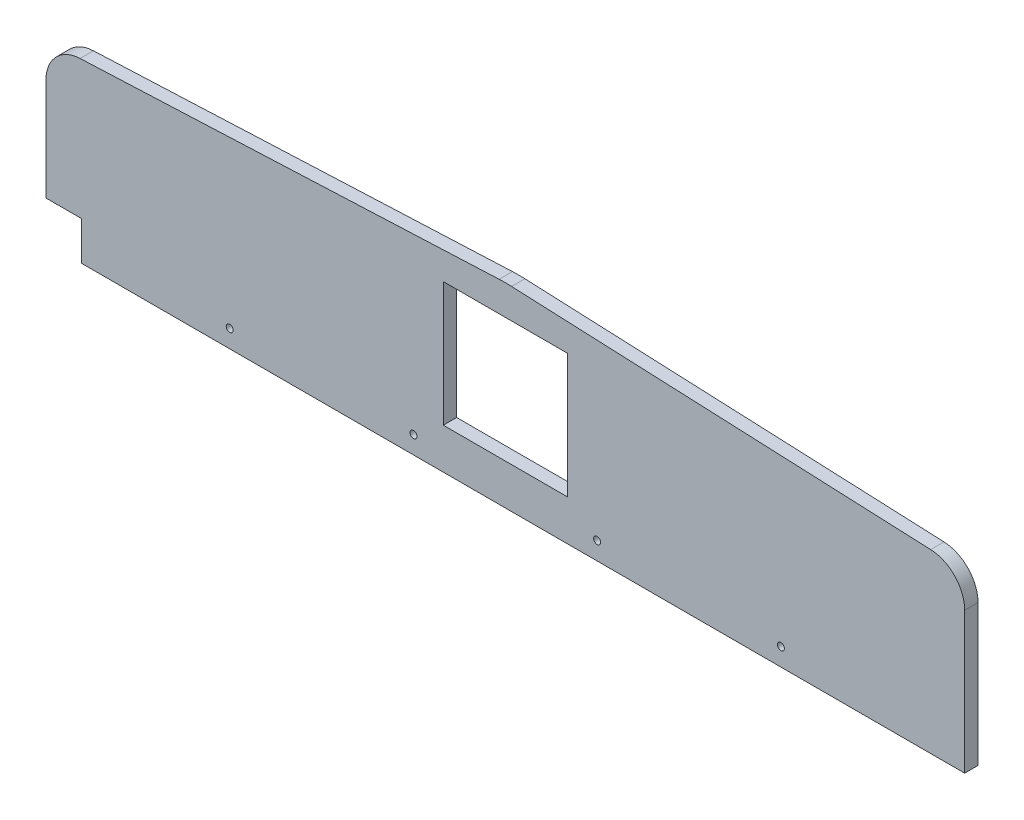
ISO-10303-21;
HEADER;
FILE_DESCRIPTION(('STEP AP214'),'2;1');
FILE_NAME('part.step','',(''),(''),'','','');
FILE_SCHEMA(('AUTOMOTIVE_DESIGN { 1 0 10303 214 1 1 1 1 }'));
ENDSEC;
DATA;
#1=APPLICATION_CONTEXT('core data for automotive mechanical design processes');
#2=APPLICATION_PROTOCOL_DEFINITION('international standard','automotive_design',2000,#1);
#3=PRODUCT_CONTEXT('',#1,'mechanical');
#4=PRODUCT('Part','Part','',(#3));
#5=PRODUCT_RELATED_PRODUCT_CATEGORY('part','',(#4));
#6=PRODUCT_DEFINITION_FORMATION('','',#4);
#7=PRODUCT_DEFINITION_CONTEXT('part definition',#1,'design');
#8=PRODUCT_DEFINITION('design','',#6,#7);
#9=PRODUCT_DEFINITION_SHAPE('','',#8);
#10=(LENGTH_UNIT() NAMED_UNIT(*) SI_UNIT(.MILLI.,.METRE.));
#11=(NAMED_UNIT(*) PLANE_ANGLE_UNIT() SI_UNIT($,.RADIAN.));
#12=(NAMED_UNIT(*) SI_UNIT($,.STERADIAN.) SOLID_ANGLE_UNIT());
#13=UNCERTAINTY_MEASURE_WITH_UNIT(LENGTH_MEASURE(1.E-05),#10,'distance_accuracy_value','');
#14=(GEOMETRIC_REPRESENTATION_CONTEXT(3) GLOBAL_UNCERTAINTY_ASSIGNED_CONTEXT((#13)) GLOBAL_UNIT_ASSIGNED_CONTEXT((#10,
#11,#12)) REPRESENTATION_CONTEXT('',''));
#15=CARTESIAN_POINT('',(0.,0.,0.));
#16=DIRECTION('',(0.,0.,1.));
#17=DIRECTION('',(1.,0.,0.));
#18=AXIS2_PLACEMENT_3D('',#15,#16,#17);
#19=CARTESIAN_POINT('',(328.285794278,29.289499968,4.7625));
#20=DIRECTION('',(0.,1.,0.));
#21=DIRECTION('',(-1.,0.,0.));
#22=AXIS2_PLACEMENT_3D('',#19,#20,#21);
#23=PLANE('',#22);
#24=DIRECTION('',(1.,0.,0.));
#25=VECTOR('',#24,1.);
#26=CARTESIAN_POINT('',(328.285794278,29.289499968,4.7625));
#27=LINE('',#26,#25);
#28=CARTESIAN_POINT('',(-302.931514278,29.289499968,4.7625));
#29=VERTEX_POINT('',#28);
#30=CARTESIAN_POINT('',(328.285794278,29.289499968,4.7625));
#31=VERTEX_POINT('',#30);
#32=EDGE_CURVE('E194',#29,#31,#27,.T.);
#33=ORIENTED_EDGE('',*,*,#32,.F.);
#34=DIRECTION('',(0.,0.,1.));
#35=VECTOR('',#34,1.);
#36=CARTESIAN_POINT('',(-302.931514278,29.289499968,-4.7625));
#37=LINE('',#36,#35);
#38=CARTESIAN_POINT('',(-302.931514278,29.289499968,-4.7625));
#39=VERTEX_POINT('',#38);
#40=EDGE_CURVE('E180',#39,#29,#37,.T.);
#41=ORIENTED_EDGE('',*,*,#40,.F.);
#42=DIRECTION('',(1.,0.,0.));
#43=VECTOR('',#42,1.);
#44=CARTESIAN_POINT('',(328.285794278,29.289499968,-4.7625));
#45=LINE('',#44,#43);
#46=CARTESIAN_POINT('',(328.285794278,29.289499968,-4.7625));
#47=VERTEX_POINT('',#46);
#48=EDGE_CURVE('E187',#39,#47,#45,.T.);
#49=ORIENTED_EDGE('',*,*,#48,.T.);
#50=DIRECTION('',(0.,0.,-1.));
#51=VECTOR('',#50,1.);
#52=CARTESIAN_POINT('',(328.285794278,29.289499968,4.7625));
#53=LINE('',#52,#51);
#54=EDGE_CURVE('E205',#31,#47,#53,.T.);
#55=ORIENTED_EDGE('',*,*,#54,.F.);
#56=EDGE_LOOP('',(#33,#41,#49,#55));
#57=FACE_BOUND('',#56,.T.);
#58=ADVANCED_FACE('F33',(#57),#23,.F.);
#59=CARTESIAN_POINT('',(328.285794278,154.489500012,4.7625));
#60=DIRECTION('',(-1.,0.,0.));
#61=DIRECTION('',(0.,0.,1.));
#62=AXIS2_PLACEMENT_3D('',#59,#60,#61);
#63=PLANE('',#62);
#64=DIRECTION('',(0.,1.,0.));
#65=VECTOR('',#64,1.);
#66=CARTESIAN_POINT('',(328.285794278,154.489500012,-4.7625));
#67=LINE('',#66,#65);
#68=CARTESIAN_POINT('',(328.285794278,130.17604583169,-4.7625));
#69=VERTEX_POINT('',#68);
#70=EDGE_CURVE('E207',#47,#69,#67,.T.);
#71=ORIENTED_EDGE('',*,*,#70,.T.);
#72=DIRECTION('',(0.,0.,-1.));
#73=VECTOR('',#72,1.);
#74=CARTESIAN_POINT('',(328.285794278,130.17604583169,4.7625));
#75=LINE('',#74,#73);
#76=CARTESIAN_POINT('',(328.285794278,130.17604583169,4.7625));
#77=VERTEX_POINT('',#76);
#78=EDGE_CURVE('E237',#69,#77,#75,.F.);
#79=ORIENTED_EDGE('',*,*,#78,.T.);
#80=DIRECTION('',(0.,1.,0.));
#81=VECTOR('',#80,1.);
#82=CARTESIAN_POINT('',(328.285794278,55.6895,4.7625));
#83=LINE('',#82,#81);
#84=EDGE_CURVE('E197',#31,#77,#83,.T.);
#85=ORIENTED_EDGE('',*,*,#84,.F.);
#86=ORIENTED_EDGE('',*,*,#54,.T.);
#87=EDGE_LOOP('',(#71,#79,#85,#86));
#88=FACE_BOUND('',#87,.T.);
#89=ADVANCED_FACE('F286',(#88),#63,.F.);
#90=CARTESIAN_POINT('',(0.,168.8465,4.7625));
#91=DIRECTION('',(-0.0436914735007456,-0.999045071627569,0.));
#92=DIRECTION('',(0.999045071627569,-0.0436914735007456,0.));
#93=AXIS2_PLACEMENT_3D('',#90,#91,#92);
#94=PLANE('',#93);
#95=DIRECTION('',(-0.999045071627569,0.0436914735007456,0.));
#96=VECTOR('',#95,1.);
#97=CARTESIAN_POINT('',(0.,168.8465,-4.7625));
#98=LINE('',#97,#96);
#99=CARTESIAN_POINT('',(303.995557704919,155.551790651031,-4.7625));
#100=VERTEX_POINT('',#99);
#101=CARTESIAN_POINT('',(4.43874463962471,168.65237933487,-4.7625));
#102=VERTEX_POINT('',#101);
#103=EDGE_CURVE('E210',#100,#102,#98,.T.);
#104=ORIENTED_EDGE('',*,*,#103,.T.);
#105=DIRECTION('',(0.,0.,-1.));
#106=VECTOR('',#105,1.);
#107=CARTESIAN_POINT('',(4.43874463962471,168.65237933487,4.7625));
#108=LINE('',#107,#106);
#109=CARTESIAN_POINT('',(4.43874463962471,168.65237933487,4.7625));
#110=VERTEX_POINT('',#109);
#111=EDGE_CURVE('E41',#102,#110,#108,.F.);
#112=ORIENTED_EDGE('',*,*,#111,.T.);
#113=DIRECTION('',(-0.999045071627569,0.0436914735007456,0.));
#114=VECTOR('',#113,1.);
#115=CARTESIAN_POINT('',(0.,168.8465,4.7625));
#116=LINE('',#115,#114);
#117=CARTESIAN_POINT('',(303.995557704919,155.551790651031,4.7625));
#118=VERTEX_POINT('',#117);
#119=EDGE_CURVE('E200',#118,#110,#116,.T.);
#120=ORIENTED_EDGE('',*,*,#119,.F.);
#121=DIRECTION('',(0.,0.,-1.));
#122=VECTOR('',#121,1.);
#123=CARTESIAN_POINT('',(303.995557704919,155.551790651031,4.7625));
#124=LINE('',#123,#122);
#125=EDGE_CURVE('E234',#118,#100,#124,.T.);
#126=ORIENTED_EDGE('',*,*,#125,.T.);
#127=EDGE_LOOP('',(#104,#112,#120,#126));
#128=FACE_BOUND('',#127,.T.);
#129=ADVANCED_FACE('F246',(#128),#94,.F.);
#130=CARTESIAN_POINT('',(-328.331514278,154.489500012,4.7625));
#131=DIRECTION('',(0.0436854010964294,-0.999045337174967,0.));
#132=DIRECTION('',(0.999045337174967,0.0436854010964294,0.));
#133=AXIS2_PLACEMENT_3D('',#130,#131,#132);
#134=PLANE('',#133);
#135=DIRECTION('',(-0.999045337174967,-0.0436854010964294,0.));
#136=VECTOR('',#135,1.);
#137=CARTESIAN_POINT('',(-328.331514278,154.489500012,4.7625));
#138=LINE('',#137,#136);
#139=CARTESIAN_POINT('',(-4.43874581944831,168.652406314486,4.7625));
#140=VERTEX_POINT('',#139);
#141=CARTESIAN_POINT('',(-304.041123465849,155.551649472022,4.7625));
#142=VERTEX_POINT('',#141);
#143=EDGE_CURVE('E203',#140,#142,#138,.T.);
#144=ORIENTED_EDGE('',*,*,#143,.F.);
#145=DIRECTION('',(0.,0.,-1.));
#146=VECTOR('',#145,1.);
#147=CARTESIAN_POINT('',(-4.4387458194482,168.652406314486,4.7625));
#148=LINE('',#147,#146);
#149=CARTESIAN_POINT('',(-4.43874581944831,168.652406314486,-4.7625));
#150=VERTEX_POINT('',#149);
#151=EDGE_CURVE('E239',#140,#150,#148,.T.);
#152=ORIENTED_EDGE('',*,*,#151,.T.);
#153=DIRECTION('',(-0.999045337174967,-0.0436854010964294,0.));
#154=VECTOR('',#153,1.);
#155=CARTESIAN_POINT('',(-328.331514278,154.489500012,-4.7625));
#156=LINE('',#155,#154);
#157=CARTESIAN_POINT('',(-304.041123465849,155.551649472022,-4.7625));
#158=VERTEX_POINT('',#157);
#159=EDGE_CURVE('E213',#150,#158,#156,.T.);
#160=ORIENTED_EDGE('',*,*,#159,.T.);
#161=DIRECTION('',(0.,0.,-1.));
#162=VECTOR('',#161,1.);
#163=CARTESIAN_POINT('',(-304.041123465849,155.551649472022,4.7625));
#164=LINE('',#163,#162);
#165=EDGE_CURVE('E227',#158,#142,#164,.F.);
#166=ORIENTED_EDGE('',*,*,#165,.T.);
#167=EDGE_LOOP('',(#144,#152,#160,#166));
#168=FACE_BOUND('',#167,.T.);
#169=ADVANCED_FACE('F259',(#168),#134,.F.);
#170=CARTESIAN_POINT('',(-328.331514278,55.6895,4.7625));
#171=DIRECTION('',(1.,0.,0.));
#172=DIRECTION('',(0.,0.,-1.));
#173=AXIS2_PLACEMENT_3D('',#170,#171,#172);
#174=PLANE('',#173);
#175=DIRECTION('',(0.,-1.,0.));
#176=VECTOR('',#175,1.);
#177=CARTESIAN_POINT('',(-328.331514278,55.6895,-4.7625));
#178=LINE('',#177,#176);
#179=CARTESIAN_POINT('',(-328.331514278,130.175897907778,-4.7625));
#180=VERTEX_POINT('',#179);
#181=CARTESIAN_POINT('',(-328.331514278,56.975499968,-4.7625));
#182=VERTEX_POINT('',#181);
#183=EDGE_CURVE('E195',#180,#182,#178,.T.);
#184=ORIENTED_EDGE('',*,*,#183,.T.);
#185=DIRECTION('',(0.,0.,1.));
#186=VECTOR('',#185,1.);
#187=CARTESIAN_POINT('',(-328.331514278,56.975499968,-4.7625));
#188=LINE('',#187,#186);
#189=CARTESIAN_POINT('',(-328.331514278,56.975499968,4.7625));
#190=VERTEX_POINT('',#189);
#191=EDGE_CURVE('E184',#182,#190,#188,.T.);
#192=ORIENTED_EDGE('',*,*,#191,.T.);
#193=DIRECTION('',(0.,-1.,0.));
#194=VECTOR('',#193,1.);
#195=CARTESIAN_POINT('',(-328.331514278,29.289499968,4.7625));
#196=LINE('',#195,#194);
#197=CARTESIAN_POINT('',(-328.331514278,130.175897907778,4.7625));
#198=VERTEX_POINT('',#197);
#199=EDGE_CURVE('E191',#198,#190,#196,.T.);
#200=ORIENTED_EDGE('',*,*,#199,.F.);
#201=DIRECTION('',(0.,0.,-1.));
#202=VECTOR('',#201,1.);
#203=CARTESIAN_POINT('',(-328.331514278,130.175897907778,4.7625));
#204=LINE('',#203,#202);
#205=EDGE_CURVE('E219',#198,#180,#204,.T.);
#206=ORIENTED_EDGE('',*,*,#205,.T.);
#207=EDGE_LOOP('',(#184,#192,#200,#206));
#208=FACE_BOUND('',#207,.T.);
#209=ADVANCED_FACE('F268',(#208),#174,.F.);
#210=CARTESIAN_POINT('',(0.,0.,4.7625));
#211=DIRECTION('',(0.,0.,1.));
#212=DIRECTION('',(1.,0.,0.));
#213=AXIS2_PLACEMENT_3D('',#210,#211,#212);
#214=PLANE('',#213);
#215=CARTESIAN_POINT('',(-197.013514278,41.989499968,4.7625));
#216=DIRECTION('',(0.,0.,1.));
#217=DIRECTION('',(1.,0.,0.));
#218=AXIS2_PLACEMENT_3D('',#215,#216,#217);
#219=CIRCLE('',#218,2.5);
#220=CARTESIAN_POINT('',(-194.513514278,41.989499968,4.7625));
#221=VERTEX_POINT('',#220);
#222=EDGE_CURVE('E470',#221,#221,#219,.T.);
#223=ORIENTED_EDGE('',*,*,#222,.F.);
#224=EDGE_LOOP('',(#223));
#225=FACE_BOUND('',#224,.T.);
#226=CARTESIAN_POINT('',(-65.695514278,41.989499968,4.7625));
#227=DIRECTION('',(0.,0.,1.));
#228=DIRECTION('',(1.,0.,0.));
#229=AXIS2_PLACEMENT_3D('',#226,#227,#228);
#230=CIRCLE('',#229,2.49999999999999);
#231=CARTESIAN_POINT('',(-63.195514278,41.989499968,4.7625));
#232=VERTEX_POINT('',#231);
#233=EDGE_CURVE('E472',#232,#232,#230,.T.);
#234=ORIENTED_EDGE('',*,*,#233,.F.);
#235=EDGE_LOOP('',(#234));
#236=FACE_BOUND('',#235,.T.);
#237=CARTESIAN_POINT('',(65.622485722,41.989499968,4.7625));
#238=DIRECTION('',(0.,0.,1.));
#239=DIRECTION('',(1.,0.,0.));
#240=AXIS2_PLACEMENT_3D('',#237,#238,#239);
#241=CIRCLE('',#240,2.49999999999999);
#242=CARTESIAN_POINT('',(68.122485722,41.989499968,4.7625));
#243=VERTEX_POINT('',#242);
#244=EDGE_CURVE('E480',#243,#243,#241,.T.);
#245=ORIENTED_EDGE('',*,*,#244,.F.);
#246=EDGE_LOOP('',(#245));
#247=FACE_BOUND('',#246,.T.);
#248=CARTESIAN_POINT('',(196.940485722,41.989499968,4.7625));
#249=DIRECTION('',(0.,0.,1.));
#250=DIRECTION('',(1.,0.,0.));
#251=AXIS2_PLACEMENT_3D('',#248,#249,#250);
#252=CIRCLE('',#251,2.5);
#253=CARTESIAN_POINT('',(199.440485722,41.989499968,4.7625));
#254=VERTEX_POINT('',#253);
#255=EDGE_CURVE('E485',#254,#254,#252,.T.);
#256=ORIENTED_EDGE('',*,*,#255,.F.);
#257=EDGE_LOOP('',(#256));
#258=FACE_BOUND('',#257,.T.);
#259=DIRECTION('',(0.,1.,0.));
#260=VECTOR('',#259,1.);
#261=CARTESIAN_POINT('',(44.5173495735589,147.268650450239,4.7625));
#262=LINE('',#261,#260);
#263=CARTESIAN_POINT('',(44.5173495735589,58.3686504502388,4.7625));
#264=VERTEX_POINT('',#263);
#265=CARTESIAN_POINT('',(44.5173495735589,147.268650450239,4.7625));
#266=VERTEX_POINT('',#265);
#267=EDGE_CURVE('E48',#264,#266,#262,.T.);
#268=ORIENTED_EDGE('',*,*,#267,.F.);
#269=DIRECTION('',(1.,0.,0.));
#270=VECTOR('',#269,1.);
#271=CARTESIAN_POINT('',(-44.3826504264411,58.3686504502388,4.7625));
#272=LINE('',#271,#270);
#273=CARTESIAN_POINT('',(-44.3826504264411,58.3686504502388,4.7625));
#274=VERTEX_POINT('',#273);
#275=EDGE_CURVE('E151',#274,#264,#272,.T.);
#276=ORIENTED_EDGE('',*,*,#275,.F.);
#277=DIRECTION('',(0.,-1.,0.));
#278=VECTOR('',#277,1.);
#279=CARTESIAN_POINT('',(-44.3826504264411,147.268650450239,4.7625));
#280=LINE('',#279,#278);
#281=CARTESIAN_POINT('',(-44.3826504264411,147.268650450239,4.7625));
#282=VERTEX_POINT('',#281);
#283=EDGE_CURVE('E154',#282,#274,#280,.T.);
#284=ORIENTED_EDGE('',*,*,#283,.F.);
#285=DIRECTION('',(-1.,0.,0.));
#286=VECTOR('',#285,1.);
#287=CARTESIAN_POINT('',(-44.3826504264411,147.268650450239,4.7625));
#288=LINE('',#287,#286);
#289=EDGE_CURVE('E163',#266,#282,#288,.T.);
#290=ORIENTED_EDGE('',*,*,#289,.F.);
#291=EDGE_LOOP('',(#268,#276,#284,#290));
#292=FACE_BOUND('',#291,.T.);
#293=DIRECTION('',(-1.,0.,0.));
#294=VECTOR('',#293,1.);
#295=CARTESIAN_POINT('',(-328.331514278,56.975499968,4.7625));
#296=LINE('',#295,#294);
#297=CARTESIAN_POINT('',(-302.931514278,56.975499968,4.7625));
#298=VERTEX_POINT('',#297);
#299=EDGE_CURVE('E177',#298,#190,#296,.T.);
#300=ORIENTED_EDGE('',*,*,#299,.F.);
#301=DIRECTION('',(0.,1.,0.));
#302=VECTOR('',#301,1.);
#303=CARTESIAN_POINT('',(-302.931514278,29.289499968,4.7625));
#304=LINE('',#303,#302);
#305=EDGE_CURVE('E169',#29,#298,#304,.T.);
#306=ORIENTED_EDGE('',*,*,#305,.F.);
#307=ORIENTED_EDGE('',*,*,#32,.T.);
#308=ORIENTED_EDGE('',*,*,#84,.T.);
#309=CARTESIAN_POINT('',(302.885794278,130.17604583169,4.7625));
#310=DIRECTION('',(0.,0.,1.));
#311=DIRECTION('',(1.,0.,0.));
#312=AXIS2_PLACEMENT_3D('',#309,#310,#311);
#313=CIRCLE('',#312,25.4);
#314=EDGE_CURVE('E230',#77,#118,#313,.T.);
#315=ORIENTED_EDGE('',*,*,#314,.T.);
#316=ORIENTED_EDGE('',*,*,#119,.T.);
#317=CARTESIAN_POINT('',(-0.000309068051040917,67.1494000575094,4.7625));
#318=DIRECTION('',(0.,0.,1.));
#319=DIRECTION('',(1.,0.,0.));
#320=AXIS2_PLACEMENT_3D('',#317,#318,#319);
#321=CIRCLE('',#320,101.6);
#322=EDGE_CURVE('E11',#110,#140,#321,.T.);
#323=ORIENTED_EDGE('',*,*,#322,.T.);
#324=ORIENTED_EDGE('',*,*,#143,.T.);
#325=CARTESIAN_POINT('',(-302.931514278,130.175897907778,4.7625));
#326=DIRECTION('',(0.,0.,1.));
#327=DIRECTION('',(1.,0.,0.));
#328=AXIS2_PLACEMENT_3D('',#325,#326,#327);
#329=CIRCLE('',#328,25.4);
#330=EDGE_CURVE('E232',#142,#198,#329,.T.);
#331=ORIENTED_EDGE('',*,*,#330,.T.);
#332=ORIENTED_EDGE('',*,*,#199,.T.);
#333=EDGE_LOOP('',(#300,#306,#307,#308,#315,#316,#323,#324,#331,#332));
#334=FACE_BOUND('',#333,.T.);
#335=ADVANCED_FACE('F253',(#225,#236,#247,#258,#292,#334),#214,.T.);
#336=CARTESIAN_POINT('',(0.,0.,-4.7625));
#337=DIRECTION('',(0.,0.,1.));
#338=DIRECTION('',(1.,0.,0.));
#339=AXIS2_PLACEMENT_3D('',#336,#337,#338);
#340=PLANE('',#339);
#341=CARTESIAN_POINT('',(-197.013514278,41.989499968,-4.7625));
#342=DIRECTION('',(0.,0.,1.));
#343=DIRECTION('',(1.,0.,0.));
#344=AXIS2_PLACEMENT_3D('',#341,#342,#343);
#345=CIRCLE('',#344,2.5);
#346=CARTESIAN_POINT('',(-194.513514278,41.989499968,-4.7625));
#347=VERTEX_POINT('',#346);
#348=EDGE_CURVE('E467',#347,#347,#345,.T.);
#349=ORIENTED_EDGE('',*,*,#348,.T.);
#350=EDGE_LOOP('',(#349));
#351=FACE_BOUND('',#350,.T.);
#352=CARTESIAN_POINT('',(-65.695514278,41.989499968,-4.7625));
#353=DIRECTION('',(0.,0.,1.));
#354=DIRECTION('',(1.,0.,0.));
#355=AXIS2_PLACEMENT_3D('',#352,#353,#354);
#356=CIRCLE('',#355,2.5);
#357=CARTESIAN_POINT('',(-63.195514278,41.989499968,-4.7625));
#358=VERTEX_POINT('',#357);
#359=EDGE_CURVE('E477',#358,#358,#356,.T.);
#360=ORIENTED_EDGE('',*,*,#359,.T.);
#361=EDGE_LOOP('',(#360));
#362=FACE_BOUND('',#361,.T.);
#363=CARTESIAN_POINT('',(65.622485722,41.989499968,-4.7625));
#364=DIRECTION('',(0.,0.,1.));
#365=DIRECTION('',(1.,0.,0.));
#366=AXIS2_PLACEMENT_3D('',#363,#364,#365);
#367=CIRCLE('',#366,2.5);
#368=CARTESIAN_POINT('',(68.122485722,41.989499968,-4.7625));
#369=VERTEX_POINT('',#368);
#370=EDGE_CURVE('E483',#369,#369,#367,.T.);
#371=ORIENTED_EDGE('',*,*,#370,.T.);
#372=EDGE_LOOP('',(#371));
#373=FACE_BOUND('',#372,.T.);
#374=CARTESIAN_POINT('',(196.940485722,41.989499968,-4.7625));
#375=DIRECTION('',(0.,0.,1.));
#376=DIRECTION('',(1.,0.,0.));
#377=AXIS2_PLACEMENT_3D('',#374,#375,#376);
#378=CIRCLE('',#377,2.5);
#379=CARTESIAN_POINT('',(199.440485722,41.989499968,-4.7625));
#380=VERTEX_POINT('',#379);
#381=EDGE_CURVE('E157',#380,#380,#378,.T.);
#382=ORIENTED_EDGE('',*,*,#381,.T.);
#383=EDGE_LOOP('',(#382));
#384=FACE_BOUND('',#383,.T.);
#385=DIRECTION('',(1.,0.,0.));
#386=VECTOR('',#385,1.);
#387=CARTESIAN_POINT('',(-44.3826504264411,58.3686504502388,-4.7625));
#388=LINE('',#387,#386);
#389=CARTESIAN_POINT('',(-44.3826504264411,58.3686504502388,-4.7625));
#390=VERTEX_POINT('',#389);
#391=CARTESIAN_POINT('',(44.5173495735589,58.3686504502388,-4.7625));
#392=VERTEX_POINT('',#391);
#393=EDGE_CURVE('E141',#390,#392,#388,.T.);
#394=ORIENTED_EDGE('',*,*,#393,.T.);
#395=DIRECTION('',(0.,1.,0.));
#396=VECTOR('',#395,1.);
#397=CARTESIAN_POINT('',(44.5173495735589,147.268650450239,-4.7625));
#398=LINE('',#397,#396);
#399=CARTESIAN_POINT('',(44.5173495735589,147.268650450239,-4.7625));
#400=VERTEX_POINT('',#399);
#401=EDGE_CURVE('E135',#392,#400,#398,.T.);
#402=ORIENTED_EDGE('',*,*,#401,.T.);
#403=DIRECTION('',(-1.,0.,0.));
#404=VECTOR('',#403,1.);
#405=CARTESIAN_POINT('',(-44.3826504264411,147.268650450239,-4.7625));
#406=LINE('',#405,#404);
#407=CARTESIAN_POINT('',(-44.3826504264411,147.268650450239,-4.7625));
#408=VERTEX_POINT('',#407);
#409=EDGE_CURVE('E144',#400,#408,#406,.T.);
#410=ORIENTED_EDGE('',*,*,#409,.T.);
#411=DIRECTION('',(0.,-1.,0.));
#412=VECTOR('',#411,1.);
#413=CARTESIAN_POINT('',(-44.3826504264411,147.268650450239,-4.7625));
#414=LINE('',#413,#412);
#415=EDGE_CURVE('E56',#408,#390,#414,.T.);
#416=ORIENTED_EDGE('',*,*,#415,.T.);
#417=EDGE_LOOP('',(#394,#402,#410,#416));
#418=FACE_BOUND('',#417,.T.);
#419=DIRECTION('',(0.,1.,0.));
#420=VECTOR('',#419,1.);
#421=CARTESIAN_POINT('',(-302.931514278,29.289499968,-4.7625));
#422=LINE('',#421,#420);
#423=CARTESIAN_POINT('',(-302.931514278,56.975499968,-4.7625));
#424=VERTEX_POINT('',#423);
#425=EDGE_CURVE('E173',#39,#424,#422,.T.);
#426=ORIENTED_EDGE('',*,*,#425,.T.);
#427=DIRECTION('',(-1.,0.,0.));
#428=VECTOR('',#427,1.);
#429=CARTESIAN_POINT('',(-328.331514278,56.975499968,-4.7625));
#430=LINE('',#429,#428);
#431=EDGE_CURVE('E176',#424,#182,#430,.T.);
#432=ORIENTED_EDGE('',*,*,#431,.T.);
#433=ORIENTED_EDGE('',*,*,#183,.F.);
#434=CARTESIAN_POINT('',(-302.931514278,130.175897907778,-4.7625));
#435=DIRECTION('',(0.,0.,1.));
#436=DIRECTION('',(1.,0.,0.));
#437=AXIS2_PLACEMENT_3D('',#434,#435,#436);
#438=CIRCLE('',#437,25.4);
#439=EDGE_CURVE('E224',#180,#158,#438,.F.);
#440=ORIENTED_EDGE('',*,*,#439,.T.);
#441=ORIENTED_EDGE('',*,*,#159,.F.);
#442=CARTESIAN_POINT('',(-0.000309068051040917,67.1494000575094,-4.7625));
#443=DIRECTION('',(0.,0.,1.));
#444=DIRECTION('',(1.,0.,0.));
#445=AXIS2_PLACEMENT_3D('',#442,#443,#444);
#446=CIRCLE('',#445,101.6);
#447=EDGE_CURVE('E242',#150,#102,#446,.F.);
#448=ORIENTED_EDGE('',*,*,#447,.T.);
#449=ORIENTED_EDGE('',*,*,#103,.F.);
#450=CARTESIAN_POINT('',(302.885794278,130.17604583169,-4.7625));
#451=DIRECTION('',(0.,0.,1.));
#452=DIRECTION('',(1.,0.,0.));
#453=AXIS2_PLACEMENT_3D('',#450,#451,#452);
#454=CIRCLE('',#453,25.4);
#455=EDGE_CURVE('E222',#100,#69,#454,.F.);
#456=ORIENTED_EDGE('',*,*,#455,.T.);
#457=ORIENTED_EDGE('',*,*,#70,.F.);
#458=ORIENTED_EDGE('',*,*,#48,.F.);
#459=EDGE_LOOP('',(#426,#432,#433,#440,#441,#448,#449,#456,#457,#458));
#460=FACE_BOUND('',#459,.T.);
#461=ADVANCED_FACE('F148',(#351,#362,#373,#384,#418,#460),#340,.F.);
#462=CARTESIAN_POINT('',(-302.931514278,130.175897907778,4.7625));
#463=DIRECTION('',(0.,0.,-1.));
#464=DIRECTION('',(-1.,0.,0.));
#465=AXIS2_PLACEMENT_3D('',#462,#463,#464);
#466=CYLINDRICAL_SURFACE('',#465,25.4);
#467=ORIENTED_EDGE('',*,*,#330,.F.);
#468=ORIENTED_EDGE('',*,*,#165,.F.);
#469=ORIENTED_EDGE('',*,*,#439,.F.);
#470=ORIENTED_EDGE('',*,*,#205,.F.);
#471=EDGE_LOOP('',(#467,#468,#469,#470));
#472=FACE_BOUND('',#471,.T.);
#473=ADVANCED_FACE('F265',(#472),#466,.T.);
#474=CARTESIAN_POINT('',(302.885794278,130.17604583169,4.7625));
#475=DIRECTION('',(0.,0.,-1.));
#476=DIRECTION('',(-1.,0.,0.));
#477=AXIS2_PLACEMENT_3D('',#474,#475,#476);
#478=CYLINDRICAL_SURFACE('',#477,25.4);
#479=ORIENTED_EDGE('',*,*,#314,.F.);
#480=ORIENTED_EDGE('',*,*,#78,.F.);
#481=ORIENTED_EDGE('',*,*,#455,.F.);
#482=ORIENTED_EDGE('',*,*,#125,.F.);
#483=EDGE_LOOP('',(#479,#480,#481,#482));
#484=FACE_BOUND('',#483,.T.);
#485=ADVANCED_FACE('F285',(#484),#478,.T.);
#486=CARTESIAN_POINT('',(-0.000309068051040917,67.1494000575094,4.7625));
#487=DIRECTION('',(0.,0.,-1.));
#488=DIRECTION('',(-1.,0.,0.));
#489=AXIS2_PLACEMENT_3D('',#486,#487,#488);
#490=CYLINDRICAL_SURFACE('',#489,101.6);
#491=ORIENTED_EDGE('',*,*,#322,.F.);
#492=ORIENTED_EDGE('',*,*,#111,.F.);
#493=ORIENTED_EDGE('',*,*,#447,.F.);
#494=ORIENTED_EDGE('',*,*,#151,.F.);
#495=EDGE_LOOP('',(#491,#492,#493,#494));
#496=FACE_BOUND('',#495,.T.);
#497=ADVANCED_FACE('F35',(#496),#490,.T.);
#498=CARTESIAN_POINT('',(-328.331514278,56.975499968,-4.7625));
#499=DIRECTION('',(0.,1.,0.));
#500=DIRECTION('',(0.,0.,1.));
#501=AXIS2_PLACEMENT_3D('',#498,#499,#500);
#502=PLANE('',#501);
#503=ORIENTED_EDGE('',*,*,#299,.T.);
#504=ORIENTED_EDGE('',*,*,#191,.F.);
#505=ORIENTED_EDGE('',*,*,#431,.F.);
#506=DIRECTION('',(0.,0.,1.));
#507=VECTOR('',#506,1.);
#508=CARTESIAN_POINT('',(-302.931514278,56.975499968,-4.7625));
#509=LINE('',#508,#507);
#510=EDGE_CURVE('E188',#424,#298,#509,.T.);
#511=ORIENTED_EDGE('',*,*,#510,.T.);
#512=EDGE_LOOP('',(#503,#504,#505,#511));
#513=FACE_BOUND('',#512,.T.);
#514=ADVANCED_FACE('F270',(#513),#502,.F.);
#515=CARTESIAN_POINT('',(-302.931514278,29.289499968,-4.7625));
#516=DIRECTION('',(1.,0.,0.));
#517=DIRECTION('',(0.,0.,-1.));
#518=AXIS2_PLACEMENT_3D('',#515,#516,#517);
#519=PLANE('',#518);
#520=ORIENTED_EDGE('',*,*,#305,.T.);
#521=ORIENTED_EDGE('',*,*,#510,.F.);
#522=ORIENTED_EDGE('',*,*,#425,.F.);
#523=ORIENTED_EDGE('',*,*,#40,.T.);
#524=EDGE_LOOP('',(#520,#521,#522,#523));
#525=FACE_BOUND('',#524,.T.);
#526=ADVANCED_FACE('F276',(#525),#519,.F.);
#527=CARTESIAN_POINT('',(44.5173495735589,147.268650450239,-4.7625));
#528=DIRECTION('',(1.,0.,0.));
#529=DIRECTION('',(0.,1.,0.));
#530=AXIS2_PLACEMENT_3D('',#527,#528,#529);
#531=PLANE('',#530);
#532=ORIENTED_EDGE('',*,*,#267,.T.);
#533=DIRECTION('',(0.,0.,1.));
#534=VECTOR('',#533,1.);
#535=CARTESIAN_POINT('',(44.5173495735589,147.268650450239,-4.7625));
#536=LINE('',#535,#534);
#537=EDGE_CURVE('E131',#400,#266,#536,.T.);
#538=ORIENTED_EDGE('',*,*,#537,.F.);
#539=ORIENTED_EDGE('',*,*,#401,.F.);
#540=DIRECTION('',(0.,0.,1.));
#541=VECTOR('',#540,1.);
#542=CARTESIAN_POINT('',(44.5173495735589,58.3686504502388,-4.7625));
#543=LINE('',#542,#541);
#544=EDGE_CURVE('E167',#392,#264,#543,.T.);
#545=ORIENTED_EDGE('',*,*,#544,.T.);
#546=EDGE_LOOP('',(#532,#538,#539,#545));
#547=FACE_BOUND('',#546,.T.);
#548=ADVANCED_FACE('F133',(#547),#531,.F.);
#549=CARTESIAN_POINT('',(-44.3826504264411,58.3686504502388,-4.7625));
#550=DIRECTION('',(0.,-1.,0.));
#551=DIRECTION('',(0.,0.,-1.));
#552=AXIS2_PLACEMENT_3D('',#549,#550,#551);
#553=PLANE('',#552);
#554=ORIENTED_EDGE('',*,*,#275,.T.);
#555=ORIENTED_EDGE('',*,*,#544,.F.);
#556=ORIENTED_EDGE('',*,*,#393,.F.);
#557=DIRECTION('',(0.,0.,1.));
#558=VECTOR('',#557,1.);
#559=CARTESIAN_POINT('',(-44.3826504264411,58.3686504502388,-4.7625));
#560=LINE('',#559,#558);
#561=EDGE_CURVE('E170',#390,#274,#560,.T.);
#562=ORIENTED_EDGE('',*,*,#561,.T.);
#563=EDGE_LOOP('',(#554,#555,#556,#562));
#564=FACE_BOUND('',#563,.T.);
#565=ADVANCED_FACE('F398',(#564),#553,.F.);
#566=CARTESIAN_POINT('',(-44.3826504264411,147.268650450239,-4.7625));
#567=DIRECTION('',(-1.,0.,0.));
#568=DIRECTION('',(0.,-1.,0.));
#569=AXIS2_PLACEMENT_3D('',#566,#567,#568);
#570=PLANE('',#569);
#571=ORIENTED_EDGE('',*,*,#283,.T.);
#572=ORIENTED_EDGE('',*,*,#561,.F.);
#573=ORIENTED_EDGE('',*,*,#415,.F.);
#574=DIRECTION('',(0.,0.,1.));
#575=VECTOR('',#574,1.);
#576=CARTESIAN_POINT('',(-44.3826504264411,147.268650450239,-4.7625));
#577=LINE('',#576,#575);
#578=EDGE_CURVE('E140',#408,#282,#577,.T.);
#579=ORIENTED_EDGE('',*,*,#578,.T.);
#580=EDGE_LOOP('',(#571,#572,#573,#579));
#581=FACE_BOUND('',#580,.T.);
#582=ADVANCED_FACE('F405',(#581),#570,.F.);
#583=CARTESIAN_POINT('',(-44.3826504264411,147.268650450239,-4.7625));
#584=DIRECTION('',(0.,1.,0.));
#585=DIRECTION('',(0.,0.,1.));
#586=AXIS2_PLACEMENT_3D('',#583,#584,#585);
#587=PLANE('',#586);
#588=ORIENTED_EDGE('',*,*,#289,.T.);
#589=ORIENTED_EDGE('',*,*,#578,.F.);
#590=ORIENTED_EDGE('',*,*,#409,.F.);
#591=ORIENTED_EDGE('',*,*,#537,.T.);
#592=EDGE_LOOP('',(#588,#589,#590,#591));
#593=FACE_BOUND('',#592,.T.);
#594=ADVANCED_FACE('F145',(#593),#587,.F.);
#595=CARTESIAN_POINT('',(196.940485722,41.989499968,4.7625));
#596=DIRECTION('',(0.,0.,1.));
#597=DIRECTION('',(1.,0.,0.));
#598=AXIS2_PLACEMENT_3D('',#595,#596,#597);
#599=CYLINDRICAL_SURFACE('',#598,2.5);
#600=ORIENTED_EDGE('',*,*,#381,.F.);
#601=EDGE_LOOP('',(#600));
#602=FACE_BOUND('',#601,.T.);
#603=ORIENTED_EDGE('',*,*,#255,.T.);
#604=EDGE_LOOP('',(#603));
#605=FACE_BOUND('',#604,.T.);
#606=ADVANCED_FACE('F420',(#602,#605),#599,.F.);
#607=CARTESIAN_POINT('',(65.622485722,41.989499968,4.7625));
#608=DIRECTION('',(0.,0.,1.));
#609=DIRECTION('',(1.,0.,0.));
#610=AXIS2_PLACEMENT_3D('',#607,#608,#609);
#611=CYLINDRICAL_SURFACE('',#610,2.5);
#612=ORIENTED_EDGE('',*,*,#370,.F.);
#613=EDGE_LOOP('',(#612));
#614=FACE_BOUND('',#613,.T.);
#615=ORIENTED_EDGE('',*,*,#244,.T.);
#616=EDGE_LOOP('',(#615));
#617=FACE_BOUND('',#616,.T.);
#618=ADVANCED_FACE('F426',(#614,#617),#611,.F.);
#619=CARTESIAN_POINT('',(-65.695514278,41.989499968,4.7625));
#620=DIRECTION('',(0.,0.,1.));
#621=DIRECTION('',(1.,0.,0.));
#622=AXIS2_PLACEMENT_3D('',#619,#620,#621);
#623=CYLINDRICAL_SURFACE('',#622,2.5);
#624=ORIENTED_EDGE('',*,*,#359,.F.);
#625=EDGE_LOOP('',(#624));
#626=FACE_BOUND('',#625,.T.);
#627=ORIENTED_EDGE('',*,*,#233,.T.);
#628=EDGE_LOOP('',(#627));
#629=FACE_BOUND('',#628,.T.);
#630=ADVANCED_FACE('F435',(#626,#629),#623,.F.);
#631=CARTESIAN_POINT('',(-197.013514278,41.989499968,4.7625));
#632=DIRECTION('',(0.,0.,1.));
#633=DIRECTION('',(1.,0.,0.));
#634=AXIS2_PLACEMENT_3D('',#631,#632,#633);
#635=CYLINDRICAL_SURFACE('',#634,2.5);
#636=ORIENTED_EDGE('',*,*,#348,.F.);
#637=EDGE_LOOP('',(#636));
#638=FACE_BOUND('',#637,.T.);
#639=ORIENTED_EDGE('',*,*,#222,.T.);
#640=EDGE_LOOP('',(#639));
#641=FACE_BOUND('',#640,.T.);
#642=ADVANCED_FACE('F444',(#638,#641),#635,.F.);
#643=CLOSED_SHELL('',(#58,#89,#129,#169,#209,#335,#461,#473,#485,#497,#514,#526,#548,#565,#582,
#594,#606,#618,#630,#642));
#644=MANIFOLD_SOLID_BREP('B2',#643);
#645=ADVANCED_BREP_SHAPE_REPRESENTATION('',(#18,#644),#14);
#646=SHAPE_DEFINITION_REPRESENTATION(#9,#645);
ENDSEC;
END-ISO-10303-21;
